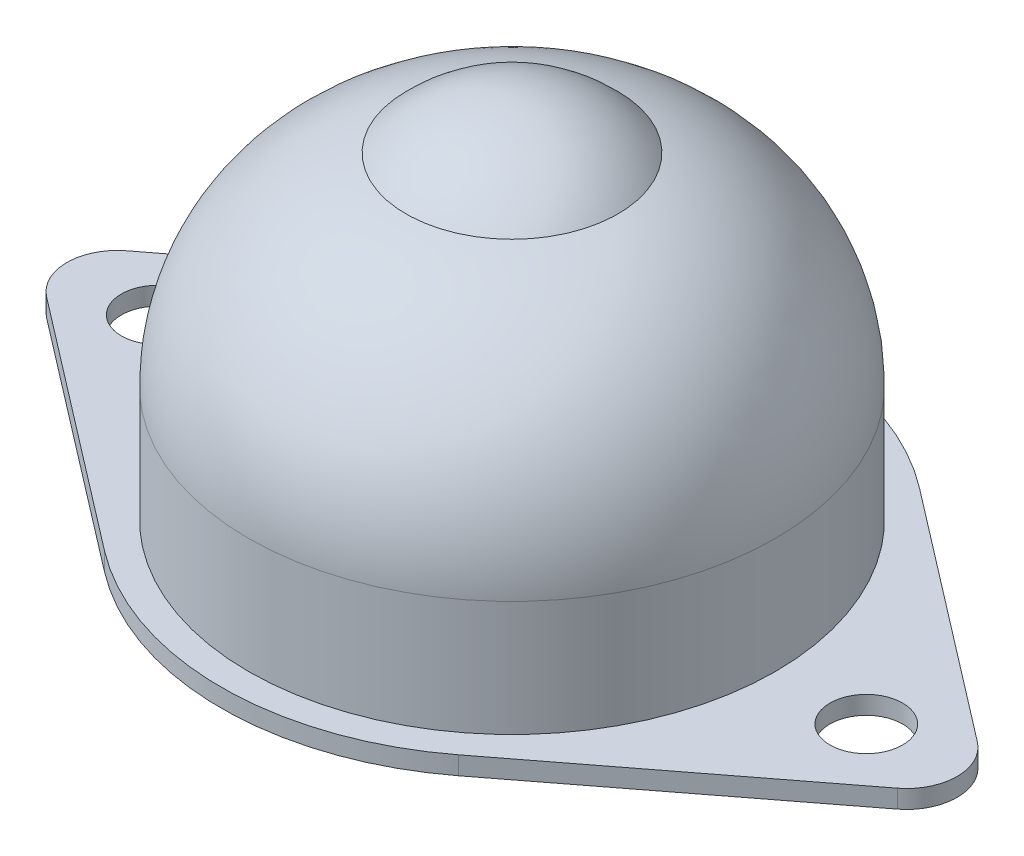
ISO-10303-21;
HEADER;
FILE_DESCRIPTION(('STEP AP214'),'2;1');
FILE_NAME('part.step','',(''),(''),'','','');
FILE_SCHEMA(('AUTOMOTIVE_DESIGN { 1 0 10303 214 1 1 1 1 }'));
ENDSEC;
DATA;
#1=APPLICATION_CONTEXT('core data for automotive mechanical design processes');
#2=APPLICATION_PROTOCOL_DEFINITION('international standard','automotive_design',2000,#1);
#3=PRODUCT_CONTEXT('',#1,'mechanical');
#4=PRODUCT('Part','Part','',(#3));
#5=PRODUCT_RELATED_PRODUCT_CATEGORY('part','',(#4));
#6=PRODUCT_DEFINITION_FORMATION('','',#4);
#7=PRODUCT_DEFINITION_CONTEXT('part definition',#1,'design');
#8=PRODUCT_DEFINITION('design','',#6,#7);
#9=PRODUCT_DEFINITION_SHAPE('','',#8);
#10=(LENGTH_UNIT() NAMED_UNIT(*) SI_UNIT(.MILLI.,.METRE.));
#11=(NAMED_UNIT(*) PLANE_ANGLE_UNIT() SI_UNIT($,.RADIAN.));
#12=(NAMED_UNIT(*) SI_UNIT($,.STERADIAN.) SOLID_ANGLE_UNIT());
#13=UNCERTAINTY_MEASURE_WITH_UNIT(LENGTH_MEASURE(1.E-05),#10,'distance_accuracy_value','');
#14=(GEOMETRIC_REPRESENTATION_CONTEXT(3) GLOBAL_UNCERTAINTY_ASSIGNED_CONTEXT((#13)) GLOBAL_UNIT_ASSIGNED_CONTEXT((#10,
#11,#12)) REPRESENTATION_CONTEXT('',''));
#15=CARTESIAN_POINT('',(0.,0.,0.));
#16=DIRECTION('',(0.,0.,1.));
#17=DIRECTION('',(1.,0.,0.));
#18=AXIS2_PLACEMENT_3D('',#15,#16,#17);
#19=CARTESIAN_POINT('',(21.7258742625085,1.,0.));
#20=DIRECTION('',(0.,-1.,0.));
#21=DIRECTION('',(0.,0.,-1.));
#22=AXIS2_PLACEMENT_3D('',#19,#20,#21);
#23=PLANE('',#22);
#24=CARTESIAN_POINT('',(0.,1.,0.));
#25=DIRECTION('',(0.,-1.,0.));
#26=DIRECTION('',(0.,0.,-1.));
#27=AXIS2_PLACEMENT_3D('',#24,#25,#26);
#28=CIRCLE('',#27,14.5);
#29=CARTESIAN_POINT('',(0.,1.,-14.5));
#30=VERTEX_POINT('',#29);
#31=EDGE_CURVE('E11',#30,#30,#28,.F.);
#32=ORIENTED_EDGE('',*,*,#31,.F.);
#33=EDGE_LOOP('',(#32));
#34=FACE_BOUND('',#33,.T.);
#35=CARTESIAN_POINT('',(21.7258742625085,1.,0.));
#36=DIRECTION('',(0.,1.,0.));
#37=DIRECTION('',(0.,0.,-1.));
#38=AXIS2_PLACEMENT_3D('',#35,#36,#37);
#39=CIRCLE('',#38,2.7741257374915);
#40=CARTESIAN_POINT('',(23.4146550107137,1.,2.20086192022677));
#41=VERTEX_POINT('',#40);
#42=CARTESIAN_POINT('',(23.4146550107137,1.,-2.20086192022677));
#43=VERTEX_POINT('',#42);
#44=EDGE_CURVE('E145',#41,#43,#39,.T.);
#45=ORIENTED_EDGE('',*,*,#44,.T.);
#46=DIRECTION('',(-0.793353340291234,0.,-0.608761429008723));
#47=VECTOR('',#46,1.);
#48=CARTESIAN_POINT('',(23.4146550107137,1.,-2.20086192022677));
#49=LINE('',#48,#47);
#50=CARTESIAN_POINT('',(9.74018286413956,1.,-12.6936534446597));
#51=VERTEX_POINT('',#50);
#52=EDGE_CURVE('E93',#43,#51,#49,.T.);
#53=ORIENTED_EDGE('',*,*,#52,.T.);
#54=CARTESIAN_POINT('',(0.,1.,0.));
#55=DIRECTION('',(0.,1.,0.));
#56=DIRECTION('',(0.,0.,1.));
#57=AXIS2_PLACEMENT_3D('',#54,#55,#56);
#58=CIRCLE('',#57,16.);
#59=CARTESIAN_POINT('',(-9.74018286413955,1.,-12.6936534446597));
#60=VERTEX_POINT('',#59);
#61=EDGE_CURVE('E177',#51,#60,#58,.T.);
#62=ORIENTED_EDGE('',*,*,#61,.T.);
#63=DIRECTION('',(-0.793353340291234,0.,0.608761429008723));
#64=VECTOR('',#63,1.);
#65=CARTESIAN_POINT('',(-23.4146550107137,1.,-2.20086192022677));
#66=LINE('',#65,#64);
#67=CARTESIAN_POINT('',(-23.4146550107137,1.,-2.20086192022677));
#68=VERTEX_POINT('',#67);
#69=EDGE_CURVE('E176',#60,#68,#66,.T.);
#70=ORIENTED_EDGE('',*,*,#69,.T.);
#71=CARTESIAN_POINT('',(-21.7258742625085,1.,0.));
#72=DIRECTION('',(0.,1.,0.));
#73=DIRECTION('',(0.,0.,1.));
#74=AXIS2_PLACEMENT_3D('',#71,#72,#73);
#75=CIRCLE('',#74,2.7741257374915);
#76=CARTESIAN_POINT('',(-23.4146550107137,1.,2.20086192022677));
#77=VERTEX_POINT('',#76);
#78=EDGE_CURVE('E112',#68,#77,#75,.T.);
#79=ORIENTED_EDGE('',*,*,#78,.T.);
#80=DIRECTION('',(0.793353340291234,0.,0.608761429008723));
#81=VECTOR('',#80,1.);
#82=CARTESIAN_POINT('',(-23.4146550107137,1.,2.20086192022677));
#83=LINE('',#82,#81);
#84=CARTESIAN_POINT('',(-9.74018286413956,1.,12.6936534446597));
#85=VERTEX_POINT('',#84);
#86=EDGE_CURVE('E106',#77,#85,#83,.T.);
#87=ORIENTED_EDGE('',*,*,#86,.T.);
#88=CARTESIAN_POINT('',(0.,1.,0.));
#89=DIRECTION('',(0.,1.,0.));
#90=DIRECTION('',(0.,0.,1.));
#91=AXIS2_PLACEMENT_3D('',#88,#89,#90);
#92=CIRCLE('',#91,16.);
#93=CARTESIAN_POINT('',(9.74018286413955,1.,12.6936534446597));
#94=VERTEX_POINT('',#93);
#95=EDGE_CURVE('E110',#85,#94,#92,.T.);
#96=ORIENTED_EDGE('',*,*,#95,.T.);
#97=DIRECTION('',(0.793353340291234,0.,-0.608761429008723));
#98=VECTOR('',#97,1.);
#99=CARTESIAN_POINT('',(23.4146550107137,1.,2.20086192022677));
#100=LINE('',#99,#98);
#101=EDGE_CURVE('E49',#94,#41,#100,.T.);
#102=ORIENTED_EDGE('',*,*,#101,.T.);
#103=EDGE_LOOP('',(#45,#53,#62,#70,#79,#87,#96,#102));
#104=FACE_BOUND('',#103,.T.);
#105=CARTESIAN_POINT('',(-19.5,1.,0.));
#106=DIRECTION('',(0.,1.,0.));
#107=DIRECTION('',(0.,0.,1.));
#108=AXIS2_PLACEMENT_3D('',#105,#106,#107);
#109=CIRCLE('',#108,2.);
#110=CARTESIAN_POINT('',(-19.5,1.,2.));
#111=VERTEX_POINT('',#110);
#112=EDGE_CURVE('E134',#111,#111,#109,.T.);
#113=ORIENTED_EDGE('',*,*,#112,.F.);
#114=EDGE_LOOP('',(#113));
#115=FACE_BOUND('',#114,.T.);
#116=CARTESIAN_POINT('',(19.5,1.,0.));
#117=DIRECTION('',(0.,1.,0.));
#118=DIRECTION('',(0.,0.,-1.));
#119=AXIS2_PLACEMENT_3D('',#116,#117,#118);
#120=CIRCLE('',#119,2.);
#121=CARTESIAN_POINT('',(19.5,1.,-2.));
#122=VERTEX_POINT('',#121);
#123=EDGE_CURVE('E186',#122,#122,#120,.T.);
#124=ORIENTED_EDGE('',*,*,#123,.F.);
#125=EDGE_LOOP('',(#124));
#126=FACE_BOUND('',#125,.T.);
#127=ADVANCED_FACE('F32',(#34,#104,#115,#126),#23,.F.);
#128=CARTESIAN_POINT('',(21.7258742625085,0.,0.));
#129=DIRECTION('',(0.,-1.,0.));
#130=DIRECTION('',(0.,0.,-1.));
#131=AXIS2_PLACEMENT_3D('',#128,#129,#130);
#132=PLANE('',#131);
#133=CARTESIAN_POINT('',(-19.5,0.,0.));
#134=DIRECTION('',(0.,1.,0.));
#135=DIRECTION('',(0.,0.,1.));
#136=AXIS2_PLACEMENT_3D('',#133,#134,#135);
#137=CIRCLE('',#136,2.);
#138=CARTESIAN_POINT('',(-19.5,0.,2.));
#139=VERTEX_POINT('',#138);
#140=EDGE_CURVE('E183',#139,#139,#137,.T.);
#141=ORIENTED_EDGE('',*,*,#140,.T.);
#142=EDGE_LOOP('',(#141));
#143=FACE_BOUND('',#142,.T.);
#144=CARTESIAN_POINT('',(21.7258742625085,0.,0.));
#145=DIRECTION('',(0.,1.,0.));
#146=DIRECTION('',(0.,0.,-1.));
#147=AXIS2_PLACEMENT_3D('',#144,#145,#146);
#148=CIRCLE('',#147,2.7741257374915);
#149=CARTESIAN_POINT('',(23.4146550107137,0.,2.20086192022677));
#150=VERTEX_POINT('',#149);
#151=CARTESIAN_POINT('',(23.4146550107137,0.,-2.20086192022677));
#152=VERTEX_POINT('',#151);
#153=EDGE_CURVE('E130',#150,#152,#148,.T.);
#154=ORIENTED_EDGE('',*,*,#153,.F.);
#155=DIRECTION('',(0.793353340291234,0.,-0.608761429008723));
#156=VECTOR('',#155,1.);
#157=CARTESIAN_POINT('',(23.4146550107137,0.,2.20086192022677));
#158=LINE('',#157,#156);
#159=CARTESIAN_POINT('',(9.74018286413955,0.,12.6936534446597));
#160=VERTEX_POINT('',#159);
#161=EDGE_CURVE('E84',#160,#150,#158,.T.);
#162=ORIENTED_EDGE('',*,*,#161,.F.);
#163=CARTESIAN_POINT('',(0.,0.,0.));
#164=DIRECTION('',(0.,1.,0.));
#165=DIRECTION('',(0.,0.,1.));
#166=AXIS2_PLACEMENT_3D('',#163,#164,#165);
#167=CIRCLE('',#166,16.);
#168=CARTESIAN_POINT('',(-9.74018286413956,0.,12.6936534446597));
#169=VERTEX_POINT('',#168);
#170=EDGE_CURVE('E78',#169,#160,#167,.T.);
#171=ORIENTED_EDGE('',*,*,#170,.F.);
#172=DIRECTION('',(0.793353340291234,0.,0.608761429008723));
#173=VECTOR('',#172,1.);
#174=CARTESIAN_POINT('',(-23.4146550107137,0.,2.20086192022677));
#175=LINE('',#174,#173);
#176=CARTESIAN_POINT('',(-23.4146550107137,0.,2.20086192022677));
#177=VERTEX_POINT('',#176);
#178=EDGE_CURVE('E120',#177,#169,#175,.T.);
#179=ORIENTED_EDGE('',*,*,#178,.F.);
#180=CARTESIAN_POINT('',(-21.7258742625085,0.,0.));
#181=DIRECTION('',(0.,1.,0.));
#182=DIRECTION('',(0.,0.,1.));
#183=AXIS2_PLACEMENT_3D('',#180,#181,#182);
#184=CIRCLE('',#183,2.7741257374915);
#185=CARTESIAN_POINT('',(-23.4146550107137,0.,-2.20086192022677));
#186=VERTEX_POINT('',#185);
#187=EDGE_CURVE('E140',#186,#177,#184,.T.);
#188=ORIENTED_EDGE('',*,*,#187,.F.);
#189=DIRECTION('',(-0.793353340291234,0.,0.608761429008723));
#190=VECTOR('',#189,1.);
#191=CARTESIAN_POINT('',(-23.4146550107137,0.,-2.20086192022677));
#192=LINE('',#191,#190);
#193=CARTESIAN_POINT('',(-9.74018286413955,0.,-12.6936534446597));
#194=VERTEX_POINT('',#193);
#195=EDGE_CURVE('E138',#194,#186,#192,.T.);
#196=ORIENTED_EDGE('',*,*,#195,.F.);
#197=CARTESIAN_POINT('',(0.,0.,0.));
#198=DIRECTION('',(0.,1.,0.));
#199=DIRECTION('',(0.,0.,1.));
#200=AXIS2_PLACEMENT_3D('',#197,#198,#199);
#201=CIRCLE('',#200,16.);
#202=CARTESIAN_POINT('',(9.74018286413956,0.,-12.6936534446597));
#203=VERTEX_POINT('',#202);
#204=EDGE_CURVE('E136',#203,#194,#201,.T.);
#205=ORIENTED_EDGE('',*,*,#204,.F.);
#206=DIRECTION('',(-0.793353340291234,0.,-0.608761429008723));
#207=VECTOR('',#206,1.);
#208=CARTESIAN_POINT('',(23.4146550107137,0.,-2.20086192022677));
#209=LINE('',#208,#207);
#210=EDGE_CURVE('E133',#152,#203,#209,.T.);
#211=ORIENTED_EDGE('',*,*,#210,.F.);
#212=EDGE_LOOP('',(#154,#162,#171,#179,#188,#196,#205,#211));
#213=FACE_BOUND('',#212,.T.);
#214=CARTESIAN_POINT('',(19.5,0.,0.));
#215=DIRECTION('',(0.,1.,0.));
#216=DIRECTION('',(0.,0.,-1.));
#217=AXIS2_PLACEMENT_3D('',#214,#215,#216);
#218=CIRCLE('',#217,2.);
#219=CARTESIAN_POINT('',(19.5,0.,-2.));
#220=VERTEX_POINT('',#219);
#221=EDGE_CURVE('E189',#220,#220,#218,.T.);
#222=ORIENTED_EDGE('',*,*,#221,.T.);
#223=EDGE_LOOP('',(#222));
#224=FACE_BOUND('',#223,.T.);
#225=ADVANCED_FACE('F163',(#143,#213,#224),#132,.T.);
#226=CARTESIAN_POINT('',(21.7258742625085,1.,0.));
#227=DIRECTION('',(0.,-1.,0.));
#228=DIRECTION('',(0.,0.,-1.));
#229=AXIS2_PLACEMENT_3D('',#226,#227,#228);
#230=CYLINDRICAL_SURFACE('',#229,2.7741257374915);
#231=ORIENTED_EDGE('',*,*,#153,.T.);
#232=DIRECTION('',(0.,-1.,0.));
#233=VECTOR('',#232,1.);
#234=CARTESIAN_POINT('',(23.4146550107137,1.,-2.20086192022677));
#235=LINE('',#234,#233);
#236=EDGE_CURVE('E41',#43,#152,#235,.T.);
#237=ORIENTED_EDGE('',*,*,#236,.F.);
#238=ORIENTED_EDGE('',*,*,#44,.F.);
#239=DIRECTION('',(0.,-1.,0.));
#240=VECTOR('',#239,1.);
#241=CARTESIAN_POINT('',(23.4146550107137,1.,2.20086192022677));
#242=LINE('',#241,#240);
#243=EDGE_CURVE('E126',#41,#150,#242,.T.);
#244=ORIENTED_EDGE('',*,*,#243,.T.);
#245=EDGE_LOOP('',(#231,#237,#238,#244));
#246=FACE_BOUND('',#245,.T.);
#247=ADVANCED_FACE('F34',(#246),#230,.T.);
#248=CARTESIAN_POINT('',(23.4146550107137,1.,-2.20086192022677));
#249=DIRECTION('',(-0.608761429008723,0.,0.793353340291234));
#250=DIRECTION('',(0.793353340291234,0.,0.608761429008723));
#251=AXIS2_PLACEMENT_3D('',#248,#249,#250);
#252=PLANE('',#251);
#253=ORIENTED_EDGE('',*,*,#210,.T.);
#254=DIRECTION('',(0.,-1.,0.));
#255=VECTOR('',#254,1.);
#256=CARTESIAN_POINT('',(9.74018286413956,1.,-12.6936534446597));
#257=LINE('',#256,#255);
#258=EDGE_CURVE('E155',#51,#203,#257,.T.);
#259=ORIENTED_EDGE('',*,*,#258,.F.);
#260=ORIENTED_EDGE('',*,*,#52,.F.);
#261=ORIENTED_EDGE('',*,*,#236,.T.);
#262=EDGE_LOOP('',(#253,#259,#260,#261));
#263=FACE_BOUND('',#262,.T.);
#264=ADVANCED_FACE('F158',(#263),#252,.F.);
#265=CARTESIAN_POINT('',(0.,1.,0.));
#266=DIRECTION('',(0.,-1.,0.));
#267=DIRECTION('',(0.,0.,-1.));
#268=AXIS2_PLACEMENT_3D('',#265,#266,#267);
#269=CYLINDRICAL_SURFACE('',#268,16.);
#270=ORIENTED_EDGE('',*,*,#204,.T.);
#271=DIRECTION('',(0.,-1.,0.));
#272=VECTOR('',#271,1.);
#273=CARTESIAN_POINT('',(-9.74018286413955,1.,-12.6936534446597));
#274=LINE('',#273,#272);
#275=EDGE_CURVE('E152',#60,#194,#274,.T.);
#276=ORIENTED_EDGE('',*,*,#275,.F.);
#277=ORIENTED_EDGE('',*,*,#61,.F.);
#278=ORIENTED_EDGE('',*,*,#258,.T.);
#279=EDGE_LOOP('',(#270,#276,#277,#278));
#280=FACE_BOUND('',#279,.T.);
#281=ADVANCED_FACE('F170',(#280),#269,.T.);
#282=CARTESIAN_POINT('',(-23.4146550107137,1.,-2.20086192022677));
#283=DIRECTION('',(0.608761429008723,0.,0.793353340291234));
#284=DIRECTION('',(0.793353340291234,0.,-0.608761429008723));
#285=AXIS2_PLACEMENT_3D('',#282,#283,#284);
#286=PLANE('',#285);
#287=ORIENTED_EDGE('',*,*,#195,.T.);
#288=DIRECTION('',(0.,-1.,0.));
#289=VECTOR('',#288,1.);
#290=CARTESIAN_POINT('',(-23.4146550107137,1.,-2.20086192022677));
#291=LINE('',#290,#289);
#292=EDGE_CURVE('E149',#68,#186,#291,.T.);
#293=ORIENTED_EDGE('',*,*,#292,.F.);
#294=ORIENTED_EDGE('',*,*,#69,.F.);
#295=ORIENTED_EDGE('',*,*,#275,.T.);
#296=EDGE_LOOP('',(#287,#293,#294,#295));
#297=FACE_BOUND('',#296,.T.);
#298=ADVANCED_FACE('F174',(#297),#286,.F.);
#299=CARTESIAN_POINT('',(-21.7258742625085,1.,0.));
#300=DIRECTION('',(0.,-1.,0.));
#301=DIRECTION('',(0.,0.,-1.));
#302=AXIS2_PLACEMENT_3D('',#299,#300,#301);
#303=CYLINDRICAL_SURFACE('',#302,2.7741257374915);
#304=ORIENTED_EDGE('',*,*,#187,.T.);
#305=DIRECTION('',(0.,-1.,0.));
#306=VECTOR('',#305,1.);
#307=CARTESIAN_POINT('',(-23.4146550107137,1.,2.20086192022677));
#308=LINE('',#307,#306);
#309=EDGE_CURVE('E121',#77,#177,#308,.T.);
#310=ORIENTED_EDGE('',*,*,#309,.F.);
#311=ORIENTED_EDGE('',*,*,#78,.F.);
#312=ORIENTED_EDGE('',*,*,#292,.T.);
#313=EDGE_LOOP('',(#304,#310,#311,#312));
#314=FACE_BOUND('',#313,.T.);
#315=ADVANCED_FACE('F237',(#314),#303,.T.);
#316=CARTESIAN_POINT('',(-23.4146550107137,1.,2.20086192022677));
#317=DIRECTION('',(0.608761429008723,0.,-0.793353340291234));
#318=DIRECTION('',(-0.793353340291234,0.,-0.608761429008723));
#319=AXIS2_PLACEMENT_3D('',#316,#317,#318);
#320=PLANE('',#319);
#321=ORIENTED_EDGE('',*,*,#178,.T.);
#322=DIRECTION('',(0.,-1.,0.));
#323=VECTOR('',#322,1.);
#324=CARTESIAN_POINT('',(-9.74018286413956,1.,12.6936534446597));
#325=LINE('',#324,#323);
#326=EDGE_CURVE('E117',#85,#169,#325,.T.);
#327=ORIENTED_EDGE('',*,*,#326,.F.);
#328=ORIENTED_EDGE('',*,*,#86,.F.);
#329=ORIENTED_EDGE('',*,*,#309,.T.);
#330=EDGE_LOOP('',(#321,#327,#328,#329));
#331=FACE_BOUND('',#330,.T.);
#332=ADVANCED_FACE('F118',(#331),#320,.F.);
#333=CARTESIAN_POINT('',(0.,1.,0.));
#334=DIRECTION('',(0.,-1.,0.));
#335=DIRECTION('',(0.,0.,-1.));
#336=AXIS2_PLACEMENT_3D('',#333,#334,#335);
#337=CYLINDRICAL_SURFACE('',#336,16.);
#338=ORIENTED_EDGE('',*,*,#170,.T.);
#339=DIRECTION('',(0.,-1.,0.));
#340=VECTOR('',#339,1.);
#341=CARTESIAN_POINT('',(9.74018286413955,1.,12.6936534446597));
#342=LINE('',#341,#340);
#343=EDGE_CURVE('E122',#94,#160,#342,.T.);
#344=ORIENTED_EDGE('',*,*,#343,.F.);
#345=ORIENTED_EDGE('',*,*,#95,.F.);
#346=ORIENTED_EDGE('',*,*,#326,.T.);
#347=EDGE_LOOP('',(#338,#344,#345,#346));
#348=FACE_BOUND('',#347,.T.);
#349=ADVANCED_FACE('F124',(#348),#337,.T.);
#350=CARTESIAN_POINT('',(23.4146550107137,1.,2.20086192022677));
#351=DIRECTION('',(-0.608761429008723,0.,-0.793353340291234));
#352=DIRECTION('',(-0.793353340291234,0.,0.608761429008723));
#353=AXIS2_PLACEMENT_3D('',#350,#351,#352);
#354=PLANE('',#353);
#355=ORIENTED_EDGE('',*,*,#161,.T.);
#356=ORIENTED_EDGE('',*,*,#243,.F.);
#357=ORIENTED_EDGE('',*,*,#101,.F.);
#358=ORIENTED_EDGE('',*,*,#343,.T.);
#359=EDGE_LOOP('',(#355,#356,#357,#358));
#360=FACE_BOUND('',#359,.T.);
#361=ADVANCED_FACE('F230',(#360),#354,.F.);
#362=CARTESIAN_POINT('',(-19.5,1.,0.));
#363=DIRECTION('',(0.,-1.,0.));
#364=DIRECTION('',(0.,0.,-1.));
#365=AXIS2_PLACEMENT_3D('',#362,#363,#364);
#366=CYLINDRICAL_SURFACE('',#365,2.);
#367=ORIENTED_EDGE('',*,*,#112,.T.);
#368=EDGE_LOOP('',(#367));
#369=FACE_BOUND('',#368,.T.);
#370=ORIENTED_EDGE('',*,*,#140,.F.);
#371=EDGE_LOOP('',(#370));
#372=FACE_BOUND('',#371,.T.);
#373=ADVANCED_FACE('F216',(#369,#372),#366,.F.);
#374=CARTESIAN_POINT('',(19.5,1.,0.));
#375=DIRECTION('',(0.,-1.,0.));
#376=DIRECTION('',(0.,0.,-1.));
#377=AXIS2_PLACEMENT_3D('',#374,#375,#376);
#378=CYLINDRICAL_SURFACE('',#377,2.);
#379=ORIENTED_EDGE('',*,*,#123,.T.);
#380=EDGE_LOOP('',(#379));
#381=FACE_BOUND('',#380,.T.);
#382=ORIENTED_EDGE('',*,*,#221,.F.);
#383=EDGE_LOOP('',(#382));
#384=FACE_BOUND('',#383,.T.);
#385=ADVANCED_FACE('F211',(#381,#384),#378,.F.);
#386=CARTESIAN_POINT('',(0.,12.9815322815895,0.));
#387=DIRECTION('',(0.,-1.,0.));
#388=DIRECTION('',(-1.,0.,0.));
#389=AXIS2_PLACEMENT_3D('',#386,#387,#388);
#390=SPHERICAL_SURFACE('',#389,8.01846771841048);
#391=CARTESIAN_POINT('',(0.,18.4805885663097,0.));
#392=DIRECTION('',(0.,-1.,0.));
#393=DIRECTION('',(0.,0.,-1.));
#394=AXIS2_PLACEMENT_3D('',#391,#392,#393);
#395=CIRCLE('',#394,5.83576940331525);
#396=CARTESIAN_POINT('',(0.,18.4805885663097,-5.83576940331525));
#397=VERTEX_POINT('',#396);
#398=EDGE_CURVE('E192',#397,#397,#395,.T.);
#399=ORIENTED_EDGE('',*,*,#398,.F.);
#400=EDGE_LOOP('',(#399));
#401=FACE_BOUND('',#400,.T.);
#402=ADVANCED_FACE('F206',(#401),#390,.T.);
#403=CARTESIAN_POINT('',(0.,7.34508338118327,0.));
#404=DIRECTION('',(0.,-1.,0.));
#405=DIRECTION('',(0.,0.,-1.));
#406=AXIS2_PLACEMENT_3D('',#403,#404,#405);
#407=DEGENERATE_TOROIDAL_SURFACE('',#406,3.01205739857175,11.4879426014283,.T.);
#408=CARTESIAN_POINT('',(0.,7.34508338118327,0.));
#409=DIRECTION('',(0.,-1.,0.));
#410=DIRECTION('',(0.,0.,-1.));
#411=AXIS2_PLACEMENT_3D('',#408,#409,#410);
#412=CIRCLE('',#411,14.5);
#413=CARTESIAN_POINT('',(0.,7.34508338118327,-14.5));
#414=VERTEX_POINT('',#413);
#415=EDGE_CURVE('E197',#414,#414,#412,.T.);
#416=ORIENTED_EDGE('',*,*,#415,.F.);
#417=EDGE_LOOP('',(#416));
#418=FACE_BOUND('',#417,.T.);
#419=ORIENTED_EDGE('',*,*,#398,.T.);
#420=EDGE_LOOP('',(#419));
#421=FACE_BOUND('',#420,.T.);
#422=ADVANCED_FACE('F203',(#418,#421),#407,.T.);
#423=CARTESIAN_POINT('',(0.,0.,0.));
#424=DIRECTION('',(0.,-1.,0.));
#425=DIRECTION('',(0.,0.,-1.));
#426=AXIS2_PLACEMENT_3D('',#423,#424,#425);
#427=CYLINDRICAL_SURFACE('',#426,14.5);
#428=ORIENTED_EDGE('',*,*,#31,.T.);
#429=EDGE_LOOP('',(#428));
#430=FACE_BOUND('',#429,.T.);
#431=ORIENTED_EDGE('',*,*,#415,.T.);
#432=EDGE_LOOP('',(#431));
#433=FACE_BOUND('',#432,.T.);
#434=ADVANCED_FACE('F201',(#430,#433),#427,.T.);
#435=CLOSED_SHELL('',(#127,#225,#247,#264,#281,#298,#315,#332,#349,#361,#373,#385,#402,#422,#434));
#436=MANIFOLD_SOLID_BREP('B2',#435);
#437=ADVANCED_BREP_SHAPE_REPRESENTATION('',(#18,#436),#14);
#438=SHAPE_DEFINITION_REPRESENTATION(#9,#437);
ENDSEC;
END-ISO-10303-21;
